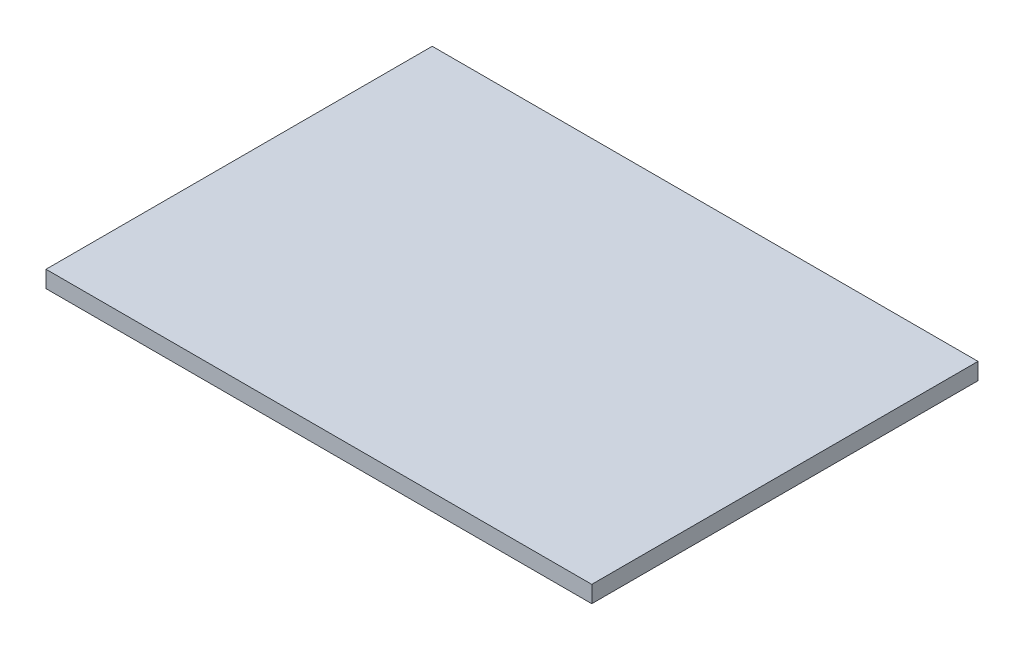
ISO-10303-21;
HEADER;
FILE_DESCRIPTION(('STEP AP214'),'2;1');
FILE_NAME('part.step','',(''),(''),'','','');
FILE_SCHEMA(('AUTOMOTIVE_DESIGN { 1 0 10303 214 1 1 1 1 }'));
ENDSEC;
DATA;
#1=APPLICATION_CONTEXT('core data for automotive mechanical design processes');
#2=APPLICATION_PROTOCOL_DEFINITION('international standard','automotive_design',2000,#1);
#3=PRODUCT_CONTEXT('',#1,'mechanical');
#4=PRODUCT('Part','Part','',(#3));
#5=PRODUCT_RELATED_PRODUCT_CATEGORY('part','',(#4));
#6=PRODUCT_DEFINITION_FORMATION('','',#4);
#7=PRODUCT_DEFINITION_CONTEXT('part definition',#1,'design');
#8=PRODUCT_DEFINITION('design','',#6,#7);
#9=PRODUCT_DEFINITION_SHAPE('','',#8);
#10=(LENGTH_UNIT() NAMED_UNIT(*) SI_UNIT(.MILLI.,.METRE.));
#11=(NAMED_UNIT(*) PLANE_ANGLE_UNIT() SI_UNIT($,.RADIAN.));
#12=(NAMED_UNIT(*) SI_UNIT($,.STERADIAN.) SOLID_ANGLE_UNIT());
#13=UNCERTAINTY_MEASURE_WITH_UNIT(LENGTH_MEASURE(1.E-05),#10,'distance_accuracy_value','');
#14=(GEOMETRIC_REPRESENTATION_CONTEXT(3) GLOBAL_UNCERTAINTY_ASSIGNED_CONTEXT((#13)) GLOBAL_UNIT_ASSIGNED_CONTEXT((#10,
#11,#12)) REPRESENTATION_CONTEXT('',''));
#15=CARTESIAN_POINT('',(0.,0.,0.));
#16=DIRECTION('',(0.,0.,1.));
#17=DIRECTION('',(1.,0.,0.));
#18=AXIS2_PLACEMENT_3D('',#15,#16,#17);
#19=CARTESIAN_POINT('',(32.5,2.,-23.));
#20=DIRECTION('',(0.,0.,1.));
#21=DIRECTION('',(1.,0.,0.));
#22=AXIS2_PLACEMENT_3D('',#19,#20,#21);
#23=PLANE('',#22);
#24=DIRECTION('',(-1.,0.,0.));
#25=VECTOR('',#24,1.);
#26=CARTESIAN_POINT('',(32.5,0.,-23.));
#27=LINE('',#26,#25);
#28=CARTESIAN_POINT('',(32.5,0.,-23.));
#29=VERTEX_POINT('',#28);
#30=CARTESIAN_POINT('',(-32.5,0.,-23.));
#31=VERTEX_POINT('',#30);
#32=EDGE_CURVE('E107',#29,#31,#27,.T.);
#33=ORIENTED_EDGE('',*,*,#32,.T.);
#34=DIRECTION('',(0.,-1.,0.));
#35=VECTOR('',#34,1.);
#36=CARTESIAN_POINT('',(-32.5,2.,-23.));
#37=LINE('',#36,#35);
#38=CARTESIAN_POINT('',(-32.5,2.,-23.));
#39=VERTEX_POINT('',#38);
#40=EDGE_CURVE('E11',#39,#31,#37,.T.);
#41=ORIENTED_EDGE('',*,*,#40,.F.);
#42=DIRECTION('',(-1.,0.,0.));
#43=VECTOR('',#42,1.);
#44=CARTESIAN_POINT('',(32.5,2.,-23.));
#45=LINE('',#44,#43);
#46=CARTESIAN_POINT('',(32.5,2.,-23.));
#47=VERTEX_POINT('',#46);
#48=EDGE_CURVE('E91',#47,#39,#45,.T.);
#49=ORIENTED_EDGE('',*,*,#48,.F.);
#50=DIRECTION('',(0.,-1.,0.));
#51=VECTOR('',#50,1.);
#52=CARTESIAN_POINT('',(32.5,2.,-23.));
#53=LINE('',#52,#51);
#54=EDGE_CURVE('E103',#47,#29,#53,.T.);
#55=ORIENTED_EDGE('',*,*,#54,.T.);
#56=EDGE_LOOP('',(#33,#41,#49,#55));
#57=FACE_BOUND('',#56,.T.);
#58=ADVANCED_FACE('F39',(#57),#23,.F.);
#59=CARTESIAN_POINT('',(-32.5,2.,23.));
#60=DIRECTION('',(1.,0.,0.));
#61=DIRECTION('',(0.,0.,-1.));
#62=AXIS2_PLACEMENT_3D('',#59,#60,#61);
#63=PLANE('',#62);
#64=DIRECTION('',(0.,0.,1.));
#65=VECTOR('',#64,1.);
#66=CARTESIAN_POINT('',(-32.5,0.,23.));
#67=LINE('',#66,#65);
#68=CARTESIAN_POINT('',(-32.5,0.,23.));
#69=VERTEX_POINT('',#68);
#70=EDGE_CURVE('E96',#31,#69,#67,.T.);
#71=ORIENTED_EDGE('',*,*,#70,.T.);
#72=DIRECTION('',(0.,-1.,0.));
#73=VECTOR('',#72,1.);
#74=CARTESIAN_POINT('',(-32.5,2.,23.));
#75=LINE('',#74,#73);
#76=CARTESIAN_POINT('',(-32.5,2.,23.));
#77=VERTEX_POINT('',#76);
#78=EDGE_CURVE('E48',#77,#69,#75,.T.);
#79=ORIENTED_EDGE('',*,*,#78,.F.);
#80=DIRECTION('',(0.,0.,1.));
#81=VECTOR('',#80,1.);
#82=CARTESIAN_POINT('',(-32.5,2.,23.));
#83=LINE('',#82,#81);
#84=EDGE_CURVE('E86',#39,#77,#83,.T.);
#85=ORIENTED_EDGE('',*,*,#84,.F.);
#86=ORIENTED_EDGE('',*,*,#40,.T.);
#87=EDGE_LOOP('',(#71,#79,#85,#86));
#88=FACE_BOUND('',#87,.T.);
#89=ADVANCED_FACE('F95',(#88),#63,.F.);
#90=CARTESIAN_POINT('',(32.5,2.,23.));
#91=DIRECTION('',(0.,0.,-1.));
#92=DIRECTION('',(-1.,0.,0.));
#93=AXIS2_PLACEMENT_3D('',#90,#91,#92);
#94=PLANE('',#93);
#95=DIRECTION('',(1.,0.,0.));
#96=VECTOR('',#95,1.);
#97=CARTESIAN_POINT('',(32.5,0.,23.));
#98=LINE('',#97,#96);
#99=CARTESIAN_POINT('',(32.5,0.,23.));
#100=VERTEX_POINT('',#99);
#101=EDGE_CURVE('E73',#69,#100,#98,.T.);
#102=ORIENTED_EDGE('',*,*,#101,.T.);
#103=DIRECTION('',(0.,-1.,0.));
#104=VECTOR('',#103,1.);
#105=CARTESIAN_POINT('',(32.5,2.,23.));
#106=LINE('',#105,#104);
#107=CARTESIAN_POINT('',(32.5,2.,23.));
#108=VERTEX_POINT('',#107);
#109=EDGE_CURVE('E98',#108,#100,#106,.T.);
#110=ORIENTED_EDGE('',*,*,#109,.F.);
#111=DIRECTION('',(1.,0.,0.));
#112=VECTOR('',#111,1.);
#113=CARTESIAN_POINT('',(32.5,2.,23.));
#114=LINE('',#113,#112);
#115=EDGE_CURVE('E89',#77,#108,#114,.T.);
#116=ORIENTED_EDGE('',*,*,#115,.F.);
#117=ORIENTED_EDGE('',*,*,#78,.T.);
#118=EDGE_LOOP('',(#102,#110,#116,#117));
#119=FACE_BOUND('',#118,.T.);
#120=ADVANCED_FACE('F99',(#119),#94,.F.);
#121=CARTESIAN_POINT('',(32.5,2.,23.));
#122=DIRECTION('',(-1.,0.,0.));
#123=DIRECTION('',(0.,0.,1.));
#124=AXIS2_PLACEMENT_3D('',#121,#122,#123);
#125=PLANE('',#124);
#126=DIRECTION('',(0.,0.,-1.));
#127=VECTOR('',#126,1.);
#128=CARTESIAN_POINT('',(32.5,0.,23.));
#129=LINE('',#128,#127);
#130=EDGE_CURVE('E79',#100,#29,#129,.T.);
#131=ORIENTED_EDGE('',*,*,#130,.T.);
#132=ORIENTED_EDGE('',*,*,#54,.F.);
#133=DIRECTION('',(0.,0.,-1.));
#134=VECTOR('',#133,1.);
#135=CARTESIAN_POINT('',(32.5,2.,23.));
#136=LINE('',#135,#134);
#137=EDGE_CURVE('E56',#108,#47,#136,.T.);
#138=ORIENTED_EDGE('',*,*,#137,.F.);
#139=ORIENTED_EDGE('',*,*,#109,.T.);
#140=EDGE_LOOP('',(#131,#132,#138,#139));
#141=FACE_BOUND('',#140,.T.);
#142=ADVANCED_FACE('F120',(#141),#125,.F.);
#143=CARTESIAN_POINT('',(0.,2.,0.));
#144=DIRECTION('',(0.,-1.,0.));
#145=DIRECTION('',(0.,0.,-1.));
#146=AXIS2_PLACEMENT_3D('',#143,#144,#145);
#147=PLANE('',#146);
#148=ORIENTED_EDGE('',*,*,#48,.T.);
#149=ORIENTED_EDGE('',*,*,#84,.T.);
#150=ORIENTED_EDGE('',*,*,#115,.T.);
#151=ORIENTED_EDGE('',*,*,#137,.T.);
#152=EDGE_LOOP('',(#148,#149,#150,#151));
#153=FACE_BOUND('',#152,.T.);
#154=ADVANCED_FACE('F87',(#153),#147,.F.);
#155=CARTESIAN_POINT('',(0.,0.,0.));
#156=DIRECTION('',(0.,-1.,0.));
#157=DIRECTION('',(0.,0.,-1.));
#158=AXIS2_PLACEMENT_3D('',#155,#156,#157);
#159=PLANE('',#158);
#160=ORIENTED_EDGE('',*,*,#32,.F.);
#161=ORIENTED_EDGE('',*,*,#130,.F.);
#162=ORIENTED_EDGE('',*,*,#101,.F.);
#163=ORIENTED_EDGE('',*,*,#70,.F.);
#164=EDGE_LOOP('',(#160,#161,#162,#163));
#165=FACE_BOUND('',#164,.T.);
#166=ADVANCED_FACE('F123',(#165),#159,.T.);
#167=CLOSED_SHELL('',(#58,#89,#120,#142,#154,#166));
#168=MANIFOLD_SOLID_BREP('B2',#167);
#169=ADVANCED_BREP_SHAPE_REPRESENTATION('',(#18,#168),#14);
#170=SHAPE_DEFINITION_REPRESENTATION(#9,#169);
ENDSEC;
END-ISO-10303-21;
